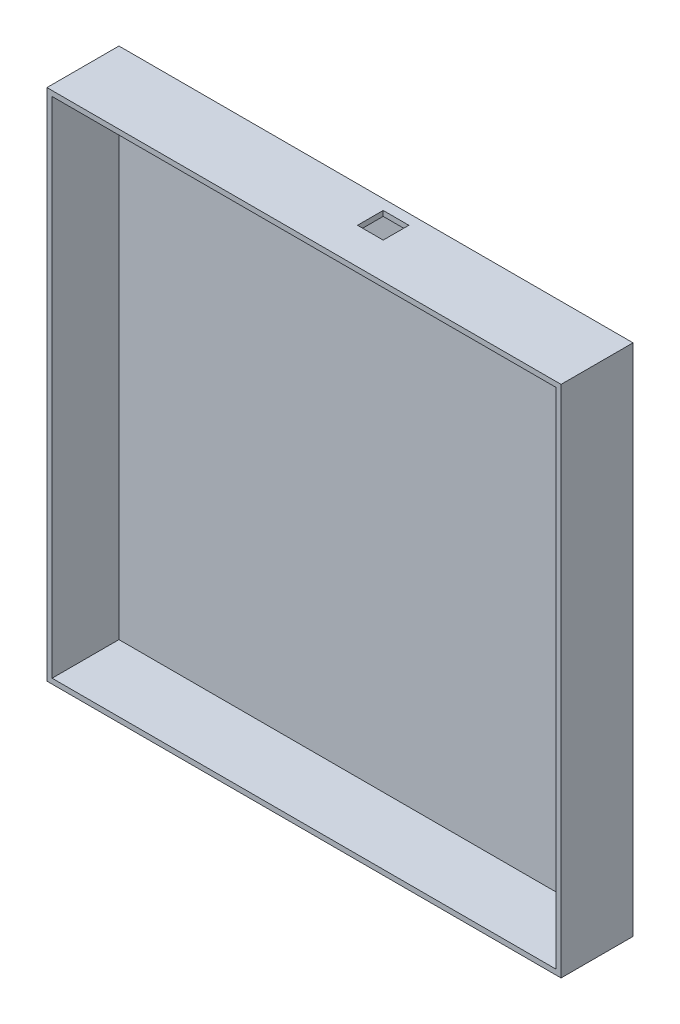
ISO-10303-21;
HEADER;
FILE_DESCRIPTION(('STEP AP214'),'2;1');
FILE_NAME('part.step','',(''),(''),'','','');
FILE_SCHEMA(('AUTOMOTIVE_DESIGN { 1 0 10303 214 1 1 1 1 }'));
ENDSEC;
DATA;
#1=APPLICATION_CONTEXT('core data for automotive mechanical design processes');
#2=APPLICATION_PROTOCOL_DEFINITION('international standard','automotive_design',2000,#1);
#3=PRODUCT_CONTEXT('',#1,'mechanical');
#4=PRODUCT('Part','Part','',(#3));
#5=PRODUCT_RELATED_PRODUCT_CATEGORY('part','',(#4));
#6=PRODUCT_DEFINITION_FORMATION('','',#4);
#7=PRODUCT_DEFINITION_CONTEXT('part definition',#1,'design');
#8=PRODUCT_DEFINITION('design','',#6,#7);
#9=PRODUCT_DEFINITION_SHAPE('','',#8);
#10=(LENGTH_UNIT() NAMED_UNIT(*) SI_UNIT(.MILLI.,.METRE.));
#11=(NAMED_UNIT(*) PLANE_ANGLE_UNIT() SI_UNIT($,.RADIAN.));
#12=(NAMED_UNIT(*) SI_UNIT($,.STERADIAN.) SOLID_ANGLE_UNIT());
#13=UNCERTAINTY_MEASURE_WITH_UNIT(LENGTH_MEASURE(1.E-05),#10,'distance_accuracy_value','');
#14=(GEOMETRIC_REPRESENTATION_CONTEXT(3) GLOBAL_UNCERTAINTY_ASSIGNED_CONTEXT((#13)) GLOBAL_UNIT_ASSIGNED_CONTEXT((#10,
#11,#12)) REPRESENTATION_CONTEXT('',''));
#15=CARTESIAN_POINT('',(0.,0.,0.));
#16=DIRECTION('',(0.,0.,1.));
#17=DIRECTION('',(1.,0.,0.));
#18=AXIS2_PLACEMENT_3D('',#15,#16,#17);
#19=CARTESIAN_POINT('',(0.,0.,13.));
#20=DIRECTION('',(0.,0.,1.));
#21=DIRECTION('',(1.,0.,0.));
#22=AXIS2_PLACEMENT_3D('',#19,#20,#21);
#23=PLANE('',#22);
#24=DIRECTION('',(0.,1.,0.));
#25=VECTOR('',#24,1.);
#26=CARTESIAN_POINT('',(50.,50.,13.));
#27=LINE('',#26,#25);
#28=CARTESIAN_POINT('',(50.,-50.,13.));
#29=VERTEX_POINT('',#28);
#30=CARTESIAN_POINT('',(50.,50.,13.));
#31=VERTEX_POINT('',#30);
#32=EDGE_CURVE('E225',#29,#31,#27,.T.);
#33=ORIENTED_EDGE('',*,*,#32,.T.);
#34=DIRECTION('',(-1.,0.,0.));
#35=VECTOR('',#34,1.);
#36=CARTESIAN_POINT('',(-50.,50.,13.));
#37=LINE('',#36,#35);
#38=CARTESIAN_POINT('',(-50.,50.,13.));
#39=VERTEX_POINT('',#38);
#40=EDGE_CURVE('E229',#31,#39,#37,.T.);
#41=ORIENTED_EDGE('',*,*,#40,.T.);
#42=DIRECTION('',(0.,-1.,0.));
#43=VECTOR('',#42,1.);
#44=CARTESIAN_POINT('',(-50.,50.,13.));
#45=LINE('',#44,#43);
#46=CARTESIAN_POINT('',(-50.,-50.,13.));
#47=VERTEX_POINT('',#46);
#48=EDGE_CURVE('E232',#39,#47,#45,.T.);
#49=ORIENTED_EDGE('',*,*,#48,.T.);
#50=DIRECTION('',(1.,0.,0.));
#51=VECTOR('',#50,1.);
#52=CARTESIAN_POINT('',(-50.,-50.,13.));
#53=LINE('',#52,#51);
#54=EDGE_CURVE('E235',#47,#29,#53,.T.);
#55=ORIENTED_EDGE('',*,*,#54,.T.);
#56=EDGE_LOOP('',(#33,#41,#49,#55));
#57=FACE_BOUND('',#56,.T.);
#58=DIRECTION('',(0.,-1.,0.));
#59=VECTOR('',#58,1.);
#60=CARTESIAN_POINT('',(-49.,49.,13.));
#61=LINE('',#60,#59);
#62=CARTESIAN_POINT('',(-49.,49.,13.));
#63=VERTEX_POINT('',#62);
#64=CARTESIAN_POINT('',(-49.,-49.,13.));
#65=VERTEX_POINT('',#64);
#66=EDGE_CURVE('E187',#63,#65,#61,.T.);
#67=ORIENTED_EDGE('',*,*,#66,.F.);
#68=DIRECTION('',(-1.,0.,0.));
#69=VECTOR('',#68,1.);
#70=CARTESIAN_POINT('',(-49.,49.,13.));
#71=LINE('',#70,#69);
#72=CARTESIAN_POINT('',(49.,49.,13.));
#73=VERTEX_POINT('',#72);
#74=EDGE_CURVE('E184',#73,#63,#71,.T.);
#75=ORIENTED_EDGE('',*,*,#74,.F.);
#76=DIRECTION('',(0.,1.,0.));
#77=VECTOR('',#76,1.);
#78=CARTESIAN_POINT('',(49.,49.,13.));
#79=LINE('',#78,#77);
#80=CARTESIAN_POINT('',(49.,-49.,13.));
#81=VERTEX_POINT('',#80);
#82=EDGE_CURVE('E195',#81,#73,#79,.T.);
#83=ORIENTED_EDGE('',*,*,#82,.F.);
#84=DIRECTION('',(1.,0.,0.));
#85=VECTOR('',#84,1.);
#86=CARTESIAN_POINT('',(-49.,-49.,13.));
#87=LINE('',#86,#85);
#88=EDGE_CURVE('E191',#65,#81,#87,.T.);
#89=ORIENTED_EDGE('',*,*,#88,.F.);
#90=EDGE_LOOP('',(#67,#75,#83,#89));
#91=FACE_BOUND('',#90,.T.);
#92=ADVANCED_FACE('F43',(#57,#91),#23,.T.);
#93=CARTESIAN_POINT('',(50.,50.,13.));
#94=DIRECTION('',(-1.,0.,0.));
#95=DIRECTION('',(0.,-1.,0.));
#96=AXIS2_PLACEMENT_3D('',#93,#94,#95);
#97=PLANE('',#96);
#98=DIRECTION('',(0.,0.,-1.));
#99=VECTOR('',#98,1.);
#100=CARTESIAN_POINT('',(50.,-50.,13.));
#101=LINE('',#100,#99);
#102=CARTESIAN_POINT('',(50.,-50.,-1.));
#103=VERTEX_POINT('',#102);
#104=EDGE_CURVE('E238',#29,#103,#101,.T.);
#105=ORIENTED_EDGE('',*,*,#104,.T.);
#106=DIRECTION('',(0.,-1.,0.));
#107=VECTOR('',#106,1.);
#108=CARTESIAN_POINT('',(50.,50.,-1.));
#109=LINE('',#108,#107);
#110=CARTESIAN_POINT('',(50.,50.,-1.));
#111=VERTEX_POINT('',#110);
#112=EDGE_CURVE('E171',#111,#103,#109,.T.);
#113=ORIENTED_EDGE('',*,*,#112,.F.);
#114=DIRECTION('',(0.,0.,-1.));
#115=VECTOR('',#114,1.);
#116=CARTESIAN_POINT('',(50.,50.,13.));
#117=LINE('',#116,#115);
#118=EDGE_CURVE('E247',#31,#111,#117,.T.);
#119=ORIENTED_EDGE('',*,*,#118,.F.);
#120=ORIENTED_EDGE('',*,*,#32,.F.);
#121=EDGE_LOOP('',(#105,#113,#119,#120));
#122=FACE_BOUND('',#121,.T.);
#123=ADVANCED_FACE('F45',(#122),#97,.F.);
#124=CARTESIAN_POINT('',(-50.,50.,13.));
#125=DIRECTION('',(0.,-1.,0.));
#126=DIRECTION('',(0.,0.,-1.));
#127=AXIS2_PLACEMENT_3D('',#124,#125,#126);
#128=PLANE('',#127);
#129=DIRECTION('',(-1.,0.,0.));
#130=VECTOR('',#129,1.);
#131=CARTESIAN_POINT('',(3.39999999999998,50.,1.));
#132=LINE('',#131,#130);
#133=CARTESIAN_POINT('',(8.39999999999998,50.,0.999999999999999));
#134=VERTEX_POINT('',#133);
#135=CARTESIAN_POINT('',(3.39999999999998,50.,1.));
#136=VERTEX_POINT('',#135);
#137=EDGE_CURVE('E145',#134,#136,#132,.T.);
#138=ORIENTED_EDGE('',*,*,#137,.F.);
#139=DIRECTION('',(0.,0.,-1.));
#140=VECTOR('',#139,1.);
#141=CARTESIAN_POINT('',(8.39999999999998,50.,1.));
#142=LINE('',#141,#140);
#143=CARTESIAN_POINT('',(8.39999999999998,50.,6.));
#144=VERTEX_POINT('',#143);
#145=EDGE_CURVE('E59',#144,#134,#142,.T.);
#146=ORIENTED_EDGE('',*,*,#145,.F.);
#147=DIRECTION('',(1.,0.,0.));
#148=VECTOR('',#147,1.);
#149=CARTESIAN_POINT('',(3.39999999999998,50.,6.));
#150=LINE('',#149,#148);
#151=CARTESIAN_POINT('',(3.39999999999998,50.,6.));
#152=VERTEX_POINT('',#151);
#153=EDGE_CURVE('E153',#152,#144,#150,.T.);
#154=ORIENTED_EDGE('',*,*,#153,.F.);
#155=DIRECTION('',(0.,0.,1.));
#156=VECTOR('',#155,1.);
#157=CARTESIAN_POINT('',(3.39999999999998,50.,1.));
#158=LINE('',#157,#156);
#159=EDGE_CURVE('E135',#136,#152,#158,.T.);
#160=ORIENTED_EDGE('',*,*,#159,.F.);
#161=EDGE_LOOP('',(#138,#146,#154,#160));
#162=FACE_BOUND('',#161,.T.);
#163=ORIENTED_EDGE('',*,*,#118,.T.);
#164=DIRECTION('',(1.,0.,0.));
#165=VECTOR('',#164,1.);
#166=CARTESIAN_POINT('',(-50.,50.,-1.));
#167=LINE('',#166,#165);
#168=CARTESIAN_POINT('',(-50.,50.,-1.));
#169=VERTEX_POINT('',#168);
#170=EDGE_CURVE('E163',#169,#111,#167,.T.);
#171=ORIENTED_EDGE('',*,*,#170,.F.);
#172=DIRECTION('',(0.,0.,-1.));
#173=VECTOR('',#172,1.);
#174=CARTESIAN_POINT('',(-50.,50.,13.));
#175=LINE('',#174,#173);
#176=EDGE_CURVE('E244',#39,#169,#175,.T.);
#177=ORIENTED_EDGE('',*,*,#176,.F.);
#178=ORIENTED_EDGE('',*,*,#40,.F.);
#179=EDGE_LOOP('',(#163,#171,#177,#178));
#180=FACE_BOUND('',#179,.T.);
#181=ADVANCED_FACE('F150',(#162,#180),#128,.F.);
#182=CARTESIAN_POINT('',(-50.,50.,13.));
#183=DIRECTION('',(1.,0.,0.));
#184=DIRECTION('',(0.,1.,0.));
#185=AXIS2_PLACEMENT_3D('',#182,#183,#184);
#186=PLANE('',#185);
#187=ORIENTED_EDGE('',*,*,#176,.T.);
#188=DIRECTION('',(0.,1.,0.));
#189=VECTOR('',#188,1.);
#190=CARTESIAN_POINT('',(-50.,-50.,-1.));
#191=LINE('',#190,#189);
#192=CARTESIAN_POINT('',(-50.,-50.,-1.));
#193=VERTEX_POINT('',#192);
#194=EDGE_CURVE('E179',#193,#169,#191,.T.);
#195=ORIENTED_EDGE('',*,*,#194,.F.);
#196=DIRECTION('',(0.,0.,-1.));
#197=VECTOR('',#196,1.);
#198=CARTESIAN_POINT('',(-50.,-50.,13.));
#199=LINE('',#198,#197);
#200=EDGE_CURVE('E241',#47,#193,#199,.T.);
#201=ORIENTED_EDGE('',*,*,#200,.F.);
#202=ORIENTED_EDGE('',*,*,#48,.F.);
#203=EDGE_LOOP('',(#187,#195,#201,#202));
#204=FACE_BOUND('',#203,.T.);
#205=ADVANCED_FACE('F291',(#204),#186,.F.);
#206=CARTESIAN_POINT('',(-50.,-50.,13.));
#207=DIRECTION('',(0.,1.,0.));
#208=DIRECTION('',(0.,0.,1.));
#209=AXIS2_PLACEMENT_3D('',#206,#207,#208);
#210=PLANE('',#209);
#211=ORIENTED_EDGE('',*,*,#200,.T.);
#212=DIRECTION('',(-1.,0.,0.));
#213=VECTOR('',#212,1.);
#214=CARTESIAN_POINT('',(50.,-50.,-1.));
#215=LINE('',#214,#213);
#216=EDGE_CURVE('E175',#103,#193,#215,.T.);
#217=ORIENTED_EDGE('',*,*,#216,.F.);
#218=ORIENTED_EDGE('',*,*,#104,.F.);
#219=ORIENTED_EDGE('',*,*,#54,.F.);
#220=EDGE_LOOP('',(#211,#217,#218,#219));
#221=FACE_BOUND('',#220,.T.);
#222=ADVANCED_FACE('F288',(#221),#210,.F.);
#223=CARTESIAN_POINT('',(-49.,49.,13.));
#224=DIRECTION('',(0.,-1.,0.));
#225=DIRECTION('',(0.,0.,-1.));
#226=AXIS2_PLACEMENT_3D('',#223,#224,#225);
#227=PLANE('',#226);
#228=DIRECTION('',(0.,0.,1.));
#229=VECTOR('',#228,1.);
#230=CARTESIAN_POINT('',(8.39999999999998,49.,13.));
#231=LINE('',#230,#229);
#232=CARTESIAN_POINT('',(8.39999999999998,49.,1.));
#233=VERTEX_POINT('',#232);
#234=CARTESIAN_POINT('',(8.39999999999998,49.,6.));
#235=VERTEX_POINT('',#234);
#236=EDGE_CURVE('E11',#233,#235,#231,.T.);
#237=ORIENTED_EDGE('',*,*,#236,.F.);
#238=DIRECTION('',(1.,0.,0.));
#239=VECTOR('',#238,1.);
#240=CARTESIAN_POINT('',(-49.,49.,0.999999999999999));
#241=LINE('',#240,#239);
#242=CARTESIAN_POINT('',(3.39999999999999,49.,0.999999999999999));
#243=VERTEX_POINT('',#242);
#244=EDGE_CURVE('E250',#243,#233,#241,.T.);
#245=ORIENTED_EDGE('',*,*,#244,.F.);
#246=DIRECTION('',(0.,0.,-1.));
#247=VECTOR('',#246,1.);
#248=CARTESIAN_POINT('',(3.39999999999998,49.,13.));
#249=LINE('',#248,#247);
#250=CARTESIAN_POINT('',(3.39999999999998,49.,6.));
#251=VERTEX_POINT('',#250);
#252=EDGE_CURVE('E138',#251,#243,#249,.T.);
#253=ORIENTED_EDGE('',*,*,#252,.F.);
#254=DIRECTION('',(-1.,0.,0.));
#255=VECTOR('',#254,1.);
#256=CARTESIAN_POINT('',(-49.,49.,6.));
#257=LINE('',#256,#255);
#258=EDGE_CURVE('E52',#235,#251,#257,.T.);
#259=ORIENTED_EDGE('',*,*,#258,.F.);
#260=EDGE_LOOP('',(#237,#245,#253,#259));
#261=FACE_BOUND('',#260,.T.);
#262=DIRECTION('',(-1.,0.,0.));
#263=VECTOR('',#262,1.);
#264=CARTESIAN_POINT('',(-49.,49.,0.));
#265=LINE('',#264,#263);
#266=CARTESIAN_POINT('',(49.,49.,0.));
#267=VERTEX_POINT('',#266);
#268=CARTESIAN_POINT('',(-49.,49.,0.));
#269=VERTEX_POINT('',#268);
#270=EDGE_CURVE('E183',#267,#269,#265,.T.);
#271=ORIENTED_EDGE('',*,*,#270,.F.);
#272=DIRECTION('',(0.,0.,-1.));
#273=VECTOR('',#272,1.);
#274=CARTESIAN_POINT('',(49.,49.,13.));
#275=LINE('',#274,#273);
#276=EDGE_CURVE('E198',#73,#267,#275,.T.);
#277=ORIENTED_EDGE('',*,*,#276,.F.);
#278=ORIENTED_EDGE('',*,*,#74,.T.);
#279=DIRECTION('',(0.,0.,-1.));
#280=VECTOR('',#279,1.);
#281=CARTESIAN_POINT('',(-49.,49.,13.));
#282=LINE('',#281,#280);
#283=EDGE_CURVE('E221',#63,#269,#282,.T.);
#284=ORIENTED_EDGE('',*,*,#283,.T.);
#285=EDGE_LOOP('',(#271,#277,#278,#284));
#286=FACE_BOUND('',#285,.T.);
#287=ADVANCED_FACE('F261',(#261,#286),#227,.T.);
#288=CARTESIAN_POINT('',(-49.,49.,13.));
#289=DIRECTION('',(1.,0.,0.));
#290=DIRECTION('',(0.,1.,0.));
#291=AXIS2_PLACEMENT_3D('',#288,#289,#290);
#292=PLANE('',#291);
#293=DIRECTION('',(0.,-1.,0.));
#294=VECTOR('',#293,1.);
#295=CARTESIAN_POINT('',(-49.,49.,0.));
#296=LINE('',#295,#294);
#297=CARTESIAN_POINT('',(-49.,-49.,0.));
#298=VERTEX_POINT('',#297);
#299=EDGE_CURVE('E202',#269,#298,#296,.T.);
#300=ORIENTED_EDGE('',*,*,#299,.F.);
#301=ORIENTED_EDGE('',*,*,#283,.F.);
#302=ORIENTED_EDGE('',*,*,#66,.T.);
#303=DIRECTION('',(0.,0.,-1.));
#304=VECTOR('',#303,1.);
#305=CARTESIAN_POINT('',(-49.,-49.,13.));
#306=LINE('',#305,#304);
#307=EDGE_CURVE('E218',#65,#298,#306,.T.);
#308=ORIENTED_EDGE('',*,*,#307,.T.);
#309=EDGE_LOOP('',(#300,#301,#302,#308));
#310=FACE_BOUND('',#309,.T.);
#311=ADVANCED_FACE('F316',(#310),#292,.T.);
#312=CARTESIAN_POINT('',(-49.,-49.,13.));
#313=DIRECTION('',(0.,1.,0.));
#314=DIRECTION('',(-1.,0.,0.));
#315=AXIS2_PLACEMENT_3D('',#312,#313,#314);
#316=PLANE('',#315);
#317=DIRECTION('',(1.,0.,0.));
#318=VECTOR('',#317,1.);
#319=CARTESIAN_POINT('',(-49.,-49.,0.));
#320=LINE('',#319,#318);
#321=CARTESIAN_POINT('',(49.,-49.,0.));
#322=VERTEX_POINT('',#321);
#323=EDGE_CURVE('E206',#298,#322,#320,.T.);
#324=ORIENTED_EDGE('',*,*,#323,.F.);
#325=ORIENTED_EDGE('',*,*,#307,.F.);
#326=ORIENTED_EDGE('',*,*,#88,.T.);
#327=DIRECTION('',(0.,0.,-1.));
#328=VECTOR('',#327,1.);
#329=CARTESIAN_POINT('',(49.,-49.,13.));
#330=LINE('',#329,#328);
#331=EDGE_CURVE('E215',#81,#322,#330,.T.);
#332=ORIENTED_EDGE('',*,*,#331,.T.);
#333=EDGE_LOOP('',(#324,#325,#326,#332));
#334=FACE_BOUND('',#333,.T.);
#335=ADVANCED_FACE('F321',(#334),#316,.T.);
#336=CARTESIAN_POINT('',(49.,49.,13.));
#337=DIRECTION('',(-1.,0.,0.));
#338=DIRECTION('',(0.,-1.,0.));
#339=AXIS2_PLACEMENT_3D('',#336,#337,#338);
#340=PLANE('',#339);
#341=DIRECTION('',(0.,1.,0.));
#342=VECTOR('',#341,1.);
#343=CARTESIAN_POINT('',(49.,49.,0.));
#344=LINE('',#343,#342);
#345=EDGE_CURVE('E188',#322,#267,#344,.T.);
#346=ORIENTED_EDGE('',*,*,#345,.F.);
#347=ORIENTED_EDGE('',*,*,#331,.F.);
#348=ORIENTED_EDGE('',*,*,#82,.T.);
#349=ORIENTED_EDGE('',*,*,#276,.T.);
#350=EDGE_LOOP('',(#346,#347,#348,#349));
#351=FACE_BOUND('',#350,.T.);
#352=ADVANCED_FACE('F328',(#351),#340,.T.);
#353=CARTESIAN_POINT('',(0.,0.,0.));
#354=DIRECTION('',(0.,0.,-1.));
#355=DIRECTION('',(-1.,0.,0.));
#356=AXIS2_PLACEMENT_3D('',#353,#354,#355);
#357=PLANE('',#356);
#358=ORIENTED_EDGE('',*,*,#345,.T.);
#359=ORIENTED_EDGE('',*,*,#270,.T.);
#360=ORIENTED_EDGE('',*,*,#299,.T.);
#361=ORIENTED_EDGE('',*,*,#323,.T.);
#362=EDGE_LOOP('',(#358,#359,#360,#361));
#363=FACE_BOUND('',#362,.T.);
#364=ADVANCED_FACE('F273',(#363),#357,.F.);
#365=CARTESIAN_POINT('',(0.,0.,-1.));
#366=DIRECTION('',(0.,0.,-1.));
#367=DIRECTION('',(-1.,0.,0.));
#368=AXIS2_PLACEMENT_3D('',#365,#366,#367);
#369=PLANE('',#368);
#370=ORIENTED_EDGE('',*,*,#170,.T.);
#371=ORIENTED_EDGE('',*,*,#112,.T.);
#372=ORIENTED_EDGE('',*,*,#216,.T.);
#373=ORIENTED_EDGE('',*,*,#194,.T.);
#374=EDGE_LOOP('',(#370,#371,#372,#373));
#375=FACE_BOUND('',#374,.T.);
#376=ADVANCED_FACE('F266',(#375),#369,.T.);
#377=CARTESIAN_POINT('',(8.39999999999998,48.,1.));
#378=DIRECTION('',(1.,0.,0.));
#379=DIRECTION('',(0.,0.,-1.));
#380=AXIS2_PLACEMENT_3D('',#377,#378,#379);
#381=PLANE('',#380);
#382=ORIENTED_EDGE('',*,*,#236,.T.);
#383=DIRECTION('',(0.,1.,0.));
#384=VECTOR('',#383,1.);
#385=CARTESIAN_POINT('',(8.39999999999998,48.,6.));
#386=LINE('',#385,#384);
#387=EDGE_CURVE('E160',#235,#144,#386,.T.);
#388=ORIENTED_EDGE('',*,*,#387,.T.);
#389=ORIENTED_EDGE('',*,*,#145,.T.);
#390=DIRECTION('',(0.,1.,0.));
#391=VECTOR('',#390,1.);
#392=CARTESIAN_POINT('',(8.39999999999998,48.,1.));
#393=LINE('',#392,#391);
#394=EDGE_CURVE('E142',#233,#134,#393,.T.);
#395=ORIENTED_EDGE('',*,*,#394,.F.);
#396=EDGE_LOOP('',(#382,#388,#389,#395));
#397=FACE_BOUND('',#396,.T.);
#398=ADVANCED_FACE('F263',(#397),#381,.F.);
#399=CARTESIAN_POINT('',(3.39999999999998,48.,6.));
#400=DIRECTION('',(0.,0.,1.));
#401=DIRECTION('',(1.,0.,0.));
#402=AXIS2_PLACEMENT_3D('',#399,#400,#401);
#403=PLANE('',#402);
#404=ORIENTED_EDGE('',*,*,#258,.T.);
#405=DIRECTION('',(0.,1.,0.));
#406=VECTOR('',#405,1.);
#407=CARTESIAN_POINT('',(3.39999999999998,48.,6.));
#408=LINE('',#407,#406);
#409=EDGE_CURVE('E141',#251,#152,#408,.T.);
#410=ORIENTED_EDGE('',*,*,#409,.T.);
#411=ORIENTED_EDGE('',*,*,#153,.T.);
#412=ORIENTED_EDGE('',*,*,#387,.F.);
#413=EDGE_LOOP('',(#404,#410,#411,#412));
#414=FACE_BOUND('',#413,.T.);
#415=ADVANCED_FACE('F258',(#414),#403,.F.);
#416=CARTESIAN_POINT('',(3.39999999999998,48.,1.));
#417=DIRECTION('',(-1.,0.,0.));
#418=DIRECTION('',(0.,0.,1.));
#419=AXIS2_PLACEMENT_3D('',#416,#417,#418);
#420=PLANE('',#419);
#421=ORIENTED_EDGE('',*,*,#252,.T.);
#422=DIRECTION('',(0.,1.,0.));
#423=VECTOR('',#422,1.);
#424=CARTESIAN_POINT('',(3.39999999999998,48.,1.));
#425=LINE('',#424,#423);
#426=EDGE_CURVE('E67',#243,#136,#425,.T.);
#427=ORIENTED_EDGE('',*,*,#426,.T.);
#428=ORIENTED_EDGE('',*,*,#159,.T.);
#429=ORIENTED_EDGE('',*,*,#409,.F.);
#430=EDGE_LOOP('',(#421,#427,#428,#429));
#431=FACE_BOUND('',#430,.T.);
#432=ADVANCED_FACE('F132',(#431),#420,.F.);
#433=CARTESIAN_POINT('',(3.39999999999998,48.,1.));
#434=DIRECTION('',(0.,0.,-1.));
#435=DIRECTION('',(-1.,0.,0.));
#436=AXIS2_PLACEMENT_3D('',#433,#434,#435);
#437=PLANE('',#436);
#438=ORIENTED_EDGE('',*,*,#244,.T.);
#439=ORIENTED_EDGE('',*,*,#394,.T.);
#440=ORIENTED_EDGE('',*,*,#137,.T.);
#441=ORIENTED_EDGE('',*,*,#426,.F.);
#442=EDGE_LOOP('',(#438,#439,#440,#441));
#443=FACE_BOUND('',#442,.T.);
#444=ADVANCED_FACE('F146',(#443),#437,.F.);
#445=CLOSED_SHELL('',(#92,#123,#181,#205,#222,#287,#311,#335,#352,#364,#376,#398,#415,#432,#444));
#446=MANIFOLD_SOLID_BREP('B2',#445);
#447=ADVANCED_BREP_SHAPE_REPRESENTATION('',(#18,#446),#14);
#448=SHAPE_DEFINITION_REPRESENTATION(#9,#447);
ENDSEC;
END-ISO-10303-21;
